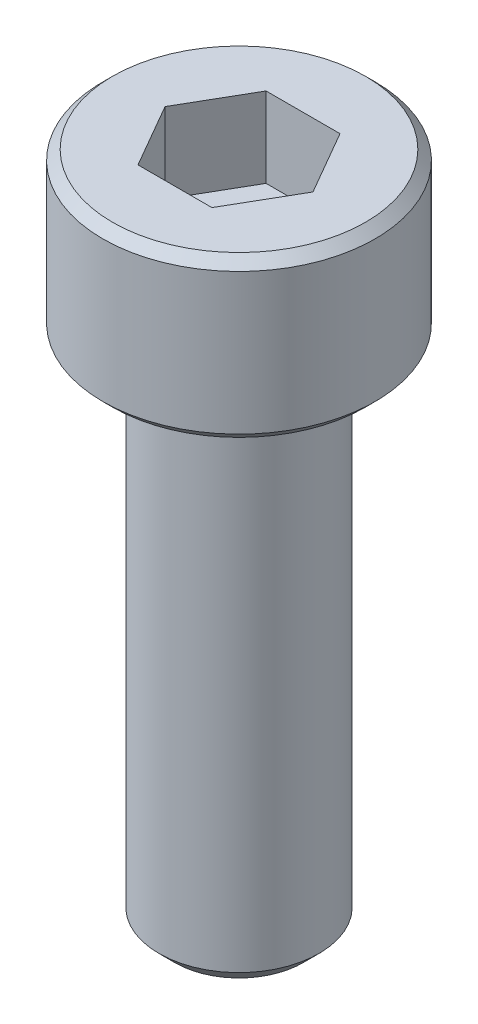
ISO-10303-21;
HEADER;
FILE_DESCRIPTION(('STEP AP214'),'2;1');
FILE_NAME('part.step','',(''),(''),'','','');
FILE_SCHEMA(('AUTOMOTIVE_DESIGN { 1 0 10303 214 1 1 1 1 }'));
ENDSEC;
DATA;
#1=APPLICATION_CONTEXT('core data for automotive mechanical design processes');
#2=APPLICATION_PROTOCOL_DEFINITION('international standard','automotive_design',2000,#1);
#3=PRODUCT_CONTEXT('',#1,'mechanical');
#4=PRODUCT('Part','Part','',(#3));
#5=PRODUCT_RELATED_PRODUCT_CATEGORY('part','',(#4));
#6=PRODUCT_DEFINITION_FORMATION('','',#4);
#7=PRODUCT_DEFINITION_CONTEXT('part definition',#1,'design');
#8=PRODUCT_DEFINITION('design','',#6,#7);
#9=PRODUCT_DEFINITION_SHAPE('','',#8);
#10=(LENGTH_UNIT() NAMED_UNIT(*) SI_UNIT(.MILLI.,.METRE.));
#11=(NAMED_UNIT(*) PLANE_ANGLE_UNIT() SI_UNIT($,.RADIAN.));
#12=(NAMED_UNIT(*) SI_UNIT($,.STERADIAN.) SOLID_ANGLE_UNIT());
#13=UNCERTAINTY_MEASURE_WITH_UNIT(LENGTH_MEASURE(1.E-05),#10,'distance_accuracy_value','');
#14=(GEOMETRIC_REPRESENTATION_CONTEXT(3) GLOBAL_UNCERTAINTY_ASSIGNED_CONTEXT((#13)) GLOBAL_UNIT_ASSIGNED_CONTEXT((#10,
#11,#12)) REPRESENTATION_CONTEXT('',''));
#15=CARTESIAN_POINT('',(0.,0.,0.));
#16=DIRECTION('',(0.,0.,1.));
#17=DIRECTION('',(1.,0.,0.));
#18=AXIS2_PLACEMENT_3D('',#15,#16,#17);
#19=CARTESIAN_POINT('',(0.,2.5,4.));
#20=DIRECTION('',(0.,-1.,0.));
#21=DIRECTION('',(0.,0.,-1.));
#22=AXIS2_PLACEMENT_3D('',#19,#20,#21);
#23=PLANE('',#22);
#24=DIRECTION('',(-0.5,0.,-0.866025403784439));
#25=VECTOR('',#24,1.);
#26=CARTESIAN_POINT('',(2.30940107675851,2.5,0.));
#27=LINE('',#26,#25);
#28=CARTESIAN_POINT('',(2.3094010767585,2.5,0.));
#29=VERTEX_POINT('',#28);
#30=CARTESIAN_POINT('',(1.15470053837925,2.5,-2.));
#31=VERTEX_POINT('',#30);
#32=EDGE_CURVE('E73',#29,#31,#27,.T.);
#33=ORIENTED_EDGE('',*,*,#32,.T.);
#34=DIRECTION('',(-1.,0.,0.));
#35=VECTOR('',#34,1.);
#36=CARTESIAN_POINT('',(1.15470053837925,2.5,-2.));
#37=LINE('',#36,#35);
#38=CARTESIAN_POINT('',(-1.15470053837925,2.5,-2.));
#39=VERTEX_POINT('',#38);
#40=EDGE_CURVE('E70',#31,#39,#37,.T.);
#41=ORIENTED_EDGE('',*,*,#40,.T.);
#42=DIRECTION('',(-0.5,0.,0.866025403784439));
#43=VECTOR('',#42,1.);
#44=CARTESIAN_POINT('',(-1.15470053837925,2.5,-2.));
#45=LINE('',#44,#43);
#46=CARTESIAN_POINT('',(-2.3094010767585,2.5,0.));
#47=VERTEX_POINT('',#46);
#48=EDGE_CURVE('E67',#39,#47,#45,.T.);
#49=ORIENTED_EDGE('',*,*,#48,.T.);
#50=DIRECTION('',(0.5,0.,0.866025403784439));
#51=VECTOR('',#50,1.);
#52=CARTESIAN_POINT('',(-2.30940107675851,2.5,0.));
#53=LINE('',#52,#51);
#54=CARTESIAN_POINT('',(-1.15470053837925,2.5,2.));
#55=VERTEX_POINT('',#54);
#56=EDGE_CURVE('E90',#47,#55,#53,.T.);
#57=ORIENTED_EDGE('',*,*,#56,.T.);
#58=DIRECTION('',(1.,0.,0.));
#59=VECTOR('',#58,1.);
#60=CARTESIAN_POINT('',(-1.15470053837925,2.5,2.));
#61=LINE('',#60,#59);
#62=CARTESIAN_POINT('',(1.15470053837925,2.5,2.));
#63=VERTEX_POINT('',#62);
#64=EDGE_CURVE('E131',#55,#63,#61,.T.);
#65=ORIENTED_EDGE('',*,*,#64,.T.);
#66=DIRECTION('',(0.5,0.,-0.866025403784439));
#67=VECTOR('',#66,1.);
#68=CARTESIAN_POINT('',(1.15470053837925,2.5,2.));
#69=LINE('',#68,#67);
#70=EDGE_CURVE('E126',#63,#29,#69,.T.);
#71=ORIENTED_EDGE('',*,*,#70,.T.);
#72=EDGE_LOOP('',(#33,#41,#49,#57,#65,#71));
#73=FACE_BOUND('',#72,.T.);
#74=ADVANCED_FACE('F16',(#73),#23,.F.);
#75=CARTESIAN_POINT('',(1.15470053837925,2.5,-2.));
#76=DIRECTION('',(0.,0.,-1.));
#77=DIRECTION('',(-1.,0.,0.));
#78=AXIS2_PLACEMENT_3D('',#75,#76,#77);
#79=PLANE('',#78);
#80=DIRECTION('',(0.,1.,0.));
#81=VECTOR('',#80,1.);
#82=CARTESIAN_POINT('',(-1.15470053837925,2.5,-2.));
#83=LINE('',#82,#81);
#84=CARTESIAN_POINT('',(-1.15470053837925,5.,-2.));
#85=VERTEX_POINT('',#84);
#86=EDGE_CURVE('E76',#85,#39,#83,.F.);
#87=ORIENTED_EDGE('',*,*,#86,.T.);
#88=ORIENTED_EDGE('',*,*,#40,.F.);
#89=DIRECTION('',(0.,1.,0.));
#90=VECTOR('',#89,1.);
#91=CARTESIAN_POINT('',(1.15470053837925,2.5,-2.));
#92=LINE('',#91,#90);
#93=CARTESIAN_POINT('',(1.15470053837925,5.,-2.));
#94=VERTEX_POINT('',#93);
#95=EDGE_CURVE('E121',#31,#94,#92,.T.);
#96=ORIENTED_EDGE('',*,*,#95,.T.);
#97=DIRECTION('',(1.,0.,0.));
#98=VECTOR('',#97,1.);
#99=CARTESIAN_POINT('',(0.,5.,-2.));
#100=LINE('',#99,#98);
#101=EDGE_CURVE('E81',#94,#85,#100,.F.);
#102=ORIENTED_EDGE('',*,*,#101,.T.);
#103=EDGE_LOOP('',(#87,#88,#96,#102));
#104=FACE_BOUND('',#103,.T.);
#105=ADVANCED_FACE('F79',(#104),#79,.F.);
#106=CARTESIAN_POINT('',(-1.15470053837925,2.5,-2.));
#107=DIRECTION('',(-0.866025403784439,0.,-0.5));
#108=DIRECTION('',(-0.5,0.,0.866025403784439));
#109=AXIS2_PLACEMENT_3D('',#106,#107,#108);
#110=PLANE('',#109);
#111=DIRECTION('',(0.,1.,0.));
#112=VECTOR('',#111,1.);
#113=CARTESIAN_POINT('',(-2.30940107675851,2.5,0.));
#114=LINE('',#113,#112);
#115=CARTESIAN_POINT('',(-2.3094010767585,5.,0.));
#116=VERTEX_POINT('',#115);
#117=EDGE_CURVE('E87',#116,#47,#114,.F.);
#118=ORIENTED_EDGE('',*,*,#117,.T.);
#119=ORIENTED_EDGE('',*,*,#48,.F.);
#120=ORIENTED_EDGE('',*,*,#86,.F.);
#121=DIRECTION('',(-0.500000000000001,0.,0.866025403784438));
#122=VECTOR('',#121,1.);
#123=CARTESIAN_POINT('',(-1.15470053837925,5.,-2.));
#124=LINE('',#123,#122);
#125=EDGE_CURVE('E118',#85,#116,#124,.T.);
#126=ORIENTED_EDGE('',*,*,#125,.T.);
#127=EDGE_LOOP('',(#118,#119,#120,#126));
#128=FACE_BOUND('',#127,.T.);
#129=ADVANCED_FACE('F85',(#128),#110,.F.);
#130=CARTESIAN_POINT('',(-2.30940107675851,2.5,0.));
#131=DIRECTION('',(-0.866025403784439,0.,0.5));
#132=DIRECTION('',(0.5,0.,0.866025403784439));
#133=AXIS2_PLACEMENT_3D('',#130,#131,#132);
#134=PLANE('',#133);
#135=DIRECTION('',(0.,-1.,0.));
#136=VECTOR('',#135,1.);
#137=CARTESIAN_POINT('',(-1.15470053837925,2.5,2.));
#138=LINE('',#137,#136);
#139=CARTESIAN_POINT('',(-1.15470053837925,5.,2.));
#140=VERTEX_POINT('',#139);
#141=EDGE_CURVE('E133',#140,#55,#138,.T.);
#142=ORIENTED_EDGE('',*,*,#141,.T.);
#143=ORIENTED_EDGE('',*,*,#56,.F.);
#144=ORIENTED_EDGE('',*,*,#117,.F.);
#145=DIRECTION('',(0.500000000000001,0.,0.866025403784438));
#146=VECTOR('',#145,1.);
#147=CARTESIAN_POINT('',(-2.30940107675851,5.,0.));
#148=LINE('',#147,#146);
#149=EDGE_CURVE('E116',#116,#140,#148,.T.);
#150=ORIENTED_EDGE('',*,*,#149,.T.);
#151=EDGE_LOOP('',(#142,#143,#144,#150));
#152=FACE_BOUND('',#151,.T.);
#153=ADVANCED_FACE('F138',(#152),#134,.F.);
#154=CARTESIAN_POINT('',(-1.15470053837925,2.5,2.));
#155=DIRECTION('',(0.,0.,1.));
#156=DIRECTION('',(0.,-1.,0.));
#157=AXIS2_PLACEMENT_3D('',#154,#155,#156);
#158=PLANE('',#157);
#159=DIRECTION('',(0.,1.,0.));
#160=VECTOR('',#159,1.);
#161=CARTESIAN_POINT('',(1.15470053837925,2.5,2.));
#162=LINE('',#161,#160);
#163=CARTESIAN_POINT('',(1.15470053837925,5.,2.));
#164=VERTEX_POINT('',#163);
#165=EDGE_CURVE('E128',#164,#63,#162,.F.);
#166=ORIENTED_EDGE('',*,*,#165,.T.);
#167=ORIENTED_EDGE('',*,*,#64,.F.);
#168=ORIENTED_EDGE('',*,*,#141,.F.);
#169=DIRECTION('',(1.,0.,0.));
#170=VECTOR('',#169,1.);
#171=CARTESIAN_POINT('',(0.,5.,2.));
#172=LINE('',#171,#170);
#173=EDGE_CURVE('E114',#140,#164,#172,.T.);
#174=ORIENTED_EDGE('',*,*,#173,.T.);
#175=EDGE_LOOP('',(#166,#167,#168,#174));
#176=FACE_BOUND('',#175,.T.);
#177=ADVANCED_FACE('F142',(#176),#158,.F.);
#178=CARTESIAN_POINT('',(1.15470053837925,2.5,2.));
#179=DIRECTION('',(0.866025403784439,0.,0.5));
#180=DIRECTION('',(0.5,0.,-0.866025403784439));
#181=AXIS2_PLACEMENT_3D('',#178,#179,#180);
#182=PLANE('',#181);
#183=DIRECTION('',(0.,1.,0.));
#184=VECTOR('',#183,1.);
#185=CARTESIAN_POINT('',(2.30940107675851,2.5,0.));
#186=LINE('',#185,#184);
#187=CARTESIAN_POINT('',(2.3094010767585,5.,0.));
#188=VERTEX_POINT('',#187);
#189=EDGE_CURVE('E124',#188,#29,#186,.F.);
#190=ORIENTED_EDGE('',*,*,#189,.T.);
#191=ORIENTED_EDGE('',*,*,#70,.F.);
#192=ORIENTED_EDGE('',*,*,#165,.F.);
#193=DIRECTION('',(0.500000000000001,0.,-0.866025403784438));
#194=VECTOR('',#193,1.);
#195=CARTESIAN_POINT('',(1.15470053837925,5.,2.));
#196=LINE('',#195,#194);
#197=EDGE_CURVE('E34',#164,#188,#196,.T.);
#198=ORIENTED_EDGE('',*,*,#197,.T.);
#199=EDGE_LOOP('',(#190,#191,#192,#198));
#200=FACE_BOUND('',#199,.T.);
#201=ADVANCED_FACE('F144',(#200),#182,.F.);
#202=CARTESIAN_POINT('',(2.30940107675851,2.5,0.));
#203=DIRECTION('',(0.866025403784439,0.,-0.5));
#204=DIRECTION('',(-0.5,0.,-0.866025403784439));
#205=AXIS2_PLACEMENT_3D('',#202,#203,#204);
#206=PLANE('',#205);
#207=ORIENTED_EDGE('',*,*,#95,.F.);
#208=ORIENTED_EDGE('',*,*,#32,.F.);
#209=ORIENTED_EDGE('',*,*,#189,.F.);
#210=DIRECTION('',(-0.5,0.,-0.866025403784438));
#211=VECTOR('',#210,1.);
#212=CARTESIAN_POINT('',(2.30940107675851,5.,0.));
#213=LINE('',#212,#211);
#214=EDGE_CURVE('E110',#188,#94,#213,.T.);
#215=ORIENTED_EDGE('',*,*,#214,.T.);
#216=EDGE_LOOP('',(#207,#208,#209,#215));
#217=FACE_BOUND('',#216,.T.);
#218=ADVANCED_FACE('F147',(#217),#206,.F.);
#219=CARTESIAN_POINT('',(0.,5.,0.));
#220=DIRECTION('',(0.,-1.,0.));
#221=DIRECTION('',(0.,0.,-1.));
#222=AXIS2_PLACEMENT_3D('',#219,#220,#221);
#223=PLANE('',#222);
#224=ORIENTED_EDGE('',*,*,#197,.F.);
#225=ORIENTED_EDGE('',*,*,#173,.F.);
#226=ORIENTED_EDGE('',*,*,#149,.F.);
#227=ORIENTED_EDGE('',*,*,#125,.F.);
#228=ORIENTED_EDGE('',*,*,#101,.F.);
#229=ORIENTED_EDGE('',*,*,#214,.F.);
#230=EDGE_LOOP('',(#224,#225,#226,#227,#228,#229));
#231=FACE_BOUND('',#230,.T.);
#232=CARTESIAN_POINT('',(0.,4.99999999999545,0.));
#233=DIRECTION('',(0.,-1.,0.));
#234=DIRECTION('',(0.,0.,-1.));
#235=AXIS2_PLACEMENT_3D('',#232,#233,#234);
#236=CIRCLE('',#235,3.94999999991796);
#237=CARTESIAN_POINT('',(0.,4.99999999999545,-3.94999999991796));
#238=VERTEX_POINT('',#237);
#239=EDGE_CURVE('E19',#238,#238,#236,.T.);
#240=ORIENTED_EDGE('',*,*,#239,.F.);
#241=EDGE_LOOP('',(#240));
#242=FACE_BOUND('',#241,.T.);
#243=ADVANCED_FACE('F149',(#231,#242),#223,.F.);
#244=CARTESIAN_POINT('',(0.,4.70000000007076,0.));
#245=DIRECTION('',(0.,-1.,0.));
#246=DIRECTION('',(0.,0.,-1.));
#247=AXIS2_PLACEMENT_3D('',#244,#245,#246);
#248=CONICAL_SURFACE('',#247,4.2499999998995,0.785398163492187);
#249=ORIENTED_EDGE('',*,*,#239,.T.);
#250=EDGE_LOOP('',(#249));
#251=FACE_BOUND('',#250,.T.);
#252=CARTESIAN_POINT('',(0.,4.7,0.));
#253=DIRECTION('',(0.,1.,0.));
#254=DIRECTION('',(0.,0.,1.));
#255=AXIS2_PLACEMENT_3D('',#252,#253,#254);
#256=CIRCLE('',#255,4.25);
#257=CARTESIAN_POINT('',(0.,4.7,4.25));
#258=VERTEX_POINT('',#257);
#259=EDGE_CURVE('E102',#258,#258,#256,.F.);
#260=ORIENTED_EDGE('',*,*,#259,.F.);
#261=EDGE_LOOP('',(#260));
#262=FACE_BOUND('',#261,.T.);
#263=ADVANCED_FACE('F152',(#251,#262),#248,.T.);
#264=CARTESIAN_POINT('',(0.,25.8940533432905,0.));
#265=DIRECTION('',(0.,1.,0.));
#266=DIRECTION('',(0.,0.,1.));
#267=AXIS2_PLACEMENT_3D('',#264,#265,#266);
#268=CYLINDRICAL_SURFACE('',#267,4.25);
#269=CARTESIAN_POINT('',(0.,0.299999999981537,0.));
#270=DIRECTION('',(0.,1.,0.));
#271=DIRECTION('',(0.,0.,1.));
#272=AXIS2_PLACEMENT_3D('',#269,#270,#271);
#273=CIRCLE('',#272,4.25000000007003);
#274=CARTESIAN_POINT('',(0.,0.299999999981537,4.25000000007003));
#275=VERTEX_POINT('',#274);
#276=EDGE_CURVE('E98',#275,#275,#273,.F.);
#277=ORIENTED_EDGE('',*,*,#276,.F.);
#278=EDGE_LOOP('',(#277));
#279=FACE_BOUND('',#278,.T.);
#280=ORIENTED_EDGE('',*,*,#259,.T.);
#281=EDGE_LOOP('',(#280));
#282=FACE_BOUND('',#281,.T.);
#283=ADVANCED_FACE('F159',(#279,#282),#268,.T.);
#284=CARTESIAN_POINT('',(2.5,-16.,0.));
#285=DIRECTION('',(0.,1.,0.));
#286=DIRECTION('',(0.,0.,1.));
#287=AXIS2_PLACEMENT_3D('',#284,#285,#286);
#288=PLANE('',#287);
#289=CARTESIAN_POINT('',(0.,-16.0000000000196,0.));
#290=DIRECTION('',(0.,1.,0.));
#291=DIRECTION('',(0.,0.,1.));
#292=AXIS2_PLACEMENT_3D('',#289,#290,#291);
#293=CIRCLE('',#292,1.99999999995271);
#294=CARTESIAN_POINT('',(0.,-16.0000000000196,1.99999999995271));
#295=VERTEX_POINT('',#294);
#296=EDGE_CURVE('E96',#295,#295,#293,.T.);
#297=ORIENTED_EDGE('',*,*,#296,.F.);
#298=EDGE_LOOP('',(#297));
#299=FACE_BOUND('',#298,.T.);
#300=ADVANCED_FACE('F164',(#299),#288,.F.);
#301=CARTESIAN_POINT('',(0.,0.299999999924694,0.));
#302=DIRECTION('',(0.,1.,0.));
#303=DIRECTION('',(0.,0.,1.));
#304=AXIS2_PLACEMENT_3D('',#301,#302,#303);
#305=CONICAL_SURFACE('',#304,4.25000000001319,0.785398163302709);
#306=CARTESIAN_POINT('',(0.,-5.6843418860808E-11,0.));
#307=DIRECTION('',(0.,1.,0.));
#308=DIRECTION('',(0.,0.,1.));
#309=AXIS2_PLACEMENT_3D('',#306,#307,#308);
#310=CIRCLE('',#309,3.95000000008849);
#311=CARTESIAN_POINT('',(0.,-5.6843418860808E-11,3.95000000008849));
#312=VERTEX_POINT('',#311);
#313=EDGE_CURVE('E94',#312,#312,#310,.T.);
#314=ORIENTED_EDGE('',*,*,#313,.T.);
#315=EDGE_LOOP('',(#314));
#316=FACE_BOUND('',#315,.T.);
#317=ORIENTED_EDGE('',*,*,#276,.T.);
#318=EDGE_LOOP('',(#317));
#319=FACE_BOUND('',#318,.T.);
#320=ADVANCED_FACE('F171',(#316,#319),#305,.T.);
#321=CARTESIAN_POINT('',(0.,-15.4999999999745,0.));
#322=DIRECTION('',(0.,1.,0.));
#323=DIRECTION('',(0.,0.,1.));
#324=AXIS2_PLACEMENT_3D('',#321,#322,#323);
#325=CONICAL_SURFACE('',#324,2.49999999999773,0.785398163397448);
#326=CARTESIAN_POINT('',(0.,-15.5,0.));
#327=DIRECTION('',(0.,1.,0.));
#328=DIRECTION('',(0.,0.,1.));
#329=AXIS2_PLACEMENT_3D('',#326,#327,#328);
#330=CIRCLE('',#329,2.5);
#331=CARTESIAN_POINT('',(0.,-15.5,2.5));
#332=VERTEX_POINT('',#331);
#333=EDGE_CURVE('E25',#332,#332,#330,.T.);
#334=ORIENTED_EDGE('',*,*,#333,.F.);
#335=EDGE_LOOP('',(#334));
#336=FACE_BOUND('',#335,.T.);
#337=ORIENTED_EDGE('',*,*,#296,.T.);
#338=EDGE_LOOP('',(#337));
#339=FACE_BOUND('',#338,.T.);
#340=ADVANCED_FACE('F182',(#336,#339),#325,.T.);
#341=CARTESIAN_POINT('',(4.25,0.,0.));
#342=DIRECTION('',(0.,1.,0.));
#343=DIRECTION('',(0.,0.,1.));
#344=AXIS2_PLACEMENT_3D('',#341,#342,#343);
#345=PLANE('',#344);
#346=CARTESIAN_POINT('',(0.,0.,0.));
#347=DIRECTION('',(0.,1.,0.));
#348=DIRECTION('',(0.,0.,1.));
#349=AXIS2_PLACEMENT_3D('',#346,#347,#348);
#350=CIRCLE('',#349,2.5);
#351=CARTESIAN_POINT('',(0.,0.,2.5));
#352=VERTEX_POINT('',#351);
#353=EDGE_CURVE('E11',#352,#352,#350,.F.);
#354=ORIENTED_EDGE('',*,*,#353,.F.);
#355=EDGE_LOOP('',(#354));
#356=FACE_BOUND('',#355,.T.);
#357=ORIENTED_EDGE('',*,*,#313,.F.);
#358=EDGE_LOOP('',(#357));
#359=FACE_BOUND('',#358,.T.);
#360=ADVANCED_FACE('F176',(#356,#359),#345,.F.);
#361=CARTESIAN_POINT('',(0.,25.8940533432905,0.));
#362=DIRECTION('',(0.,1.,0.));
#363=DIRECTION('',(0.,0.,1.));
#364=AXIS2_PLACEMENT_3D('',#361,#362,#363);
#365=CYLINDRICAL_SURFACE('',#364,2.5);
#366=ORIENTED_EDGE('',*,*,#353,.T.);
#367=EDGE_LOOP('',(#366));
#368=FACE_BOUND('',#367,.T.);
#369=ORIENTED_EDGE('',*,*,#333,.T.);
#370=EDGE_LOOP('',(#369));
#371=FACE_BOUND('',#370,.T.);
#372=ADVANCED_FACE('F174',(#368,#371),#365,.T.);
#373=CLOSED_SHELL('',(#74,#105,#129,#153,#177,#201,#218,#243,#263,#283,#300,#320,#340,#360,#372));
#374=MANIFOLD_SOLID_BREP('B1',#373);
#375=ADVANCED_BREP_SHAPE_REPRESENTATION('',(#18,#374),#14);
#376=SHAPE_DEFINITION_REPRESENTATION(#9,#375);
ENDSEC;
END-ISO-10303-21;
